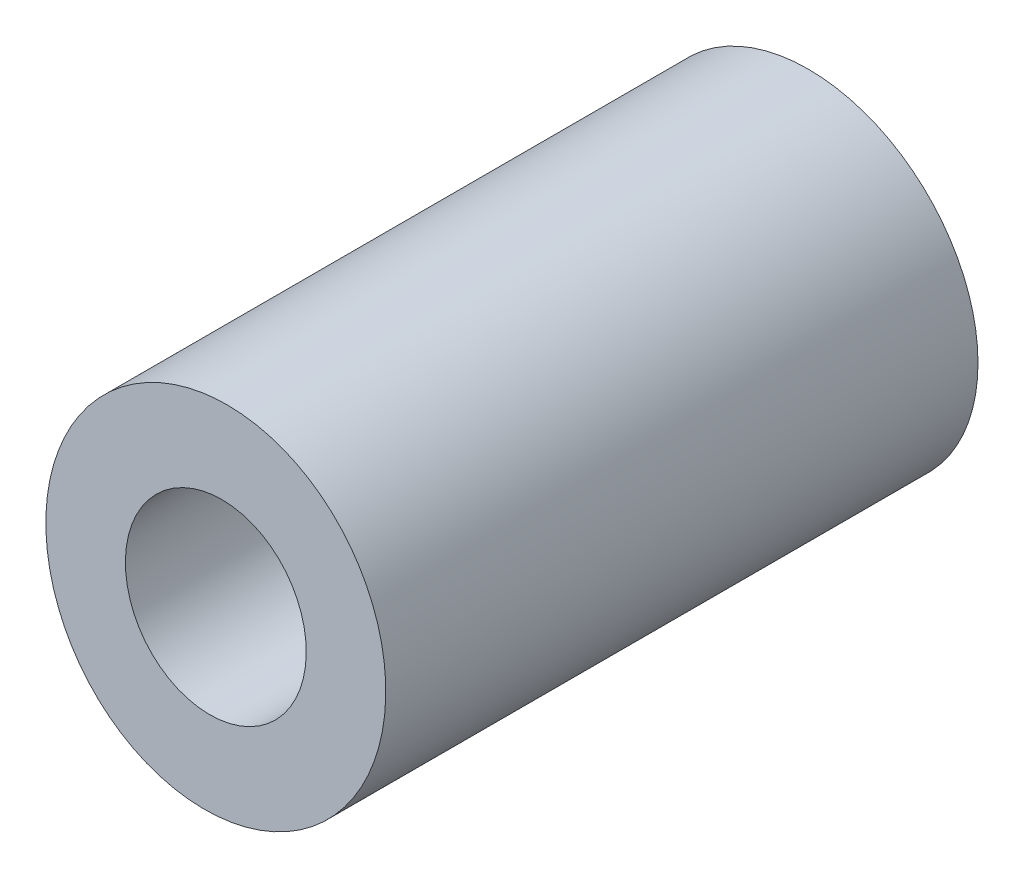
ISO-10303-21;
HEADER;
FILE_DESCRIPTION(('STEP AP214'),'2;1');
FILE_NAME('part.step','',(''),(''),'','','');
FILE_SCHEMA(('AUTOMOTIVE_DESIGN { 1 0 10303 214 1 1 1 1 }'));
ENDSEC;
DATA;
#1=APPLICATION_CONTEXT('core data for automotive mechanical design processes');
#2=APPLICATION_PROTOCOL_DEFINITION('international standard','automotive_design',2000,#1);
#3=PRODUCT_CONTEXT('',#1,'mechanical');
#4=PRODUCT('Part','Part','',(#3));
#5=PRODUCT_RELATED_PRODUCT_CATEGORY('part','',(#4));
#6=PRODUCT_DEFINITION_FORMATION('','',#4);
#7=PRODUCT_DEFINITION_CONTEXT('part definition',#1,'design');
#8=PRODUCT_DEFINITION('design','',#6,#7);
#9=PRODUCT_DEFINITION_SHAPE('','',#8);
#10=(LENGTH_UNIT() NAMED_UNIT(*) SI_UNIT(.MILLI.,.METRE.));
#11=(NAMED_UNIT(*) PLANE_ANGLE_UNIT() SI_UNIT($,.RADIAN.));
#12=(NAMED_UNIT(*) SI_UNIT($,.STERADIAN.) SOLID_ANGLE_UNIT());
#13=UNCERTAINTY_MEASURE_WITH_UNIT(LENGTH_MEASURE(1.E-05),#10,'distance_accuracy_value','');
#14=(GEOMETRIC_REPRESENTATION_CONTEXT(3) GLOBAL_UNCERTAINTY_ASSIGNED_CONTEXT((#13)) GLOBAL_UNIT_ASSIGNED_CONTEXT((#10,
#11,#12)) REPRESENTATION_CONTEXT('',''));
#15=CARTESIAN_POINT('',(0.,0.,0.));
#16=DIRECTION('',(0.,0.,1.));
#17=DIRECTION('',(1.,0.,0.));
#18=AXIS2_PLACEMENT_3D('',#15,#16,#17);
#19=CARTESIAN_POINT('',(-30.1436020560432,-132.433155104557,40.1678671930737));
#20=DIRECTION('',(0.,0.,-1.));
#21=DIRECTION('',(-1.,0.,0.));
#22=AXIS2_PLACEMENT_3D('',#19,#20,#21);
#23=CYLINDRICAL_SURFACE('',#22,6.35);
#24=CARTESIAN_POINT('',(-30.1436020560432,-132.433155104557,0.));
#25=DIRECTION('',(0.,0.,1.));
#26=DIRECTION('',(1.,0.,0.));
#27=AXIS2_PLACEMENT_3D('',#24,#25,#26);
#28=CIRCLE('',#27,6.35);
#29=CARTESIAN_POINT('',(-23.7936020560431,-132.433155104557,0.));
#30=VERTEX_POINT('',#29);
#31=EDGE_CURVE('E38',#30,#30,#28,.T.);
#32=ORIENTED_EDGE('',*,*,#31,.T.);
#33=EDGE_LOOP('',(#32));
#34=FACE_BOUND('',#33,.T.);
#35=CARTESIAN_POINT('',(-30.1436020560432,-132.433155104557,22.1875680710248));
#36=DIRECTION('',(0.,-0.0662739004000003,-0.99780146829205));
#37=DIRECTION('',(0.,0.99780146829205,-0.0662739004000003));
#38=AXIS2_PLACEMENT_3D('',#35,#36,#37);
#39=ELLIPSE('',#38,6.36399143696329,6.35);
#40=CARTESIAN_POINT('',(-30.1436020560432,-126.083155104557,21.7658015363851));
#41=VERTEX_POINT('',#40);
#42=EDGE_CURVE('E10',#41,#41,#39,.F.);
#43=ORIENTED_EDGE('',*,*,#42,.F.);
#44=EDGE_LOOP('',(#43));
#45=FACE_BOUND('',#44,.T.);
#46=ADVANCED_FACE('F31',(#34,#45),#23,.T.);
#47=CARTESIAN_POINT('',(-30.1436020560432,-132.433155104557,0.));
#48=DIRECTION('',(0.,0.,1.));
#49=DIRECTION('',(1.,0.,0.));
#50=AXIS2_PLACEMENT_3D('',#47,#48,#49);
#51=PLANE('',#50);
#52=ORIENTED_EDGE('',*,*,#31,.F.);
#53=EDGE_LOOP('',(#52));
#54=FACE_BOUND('',#53,.T.);
#55=CARTESIAN_POINT('',(-30.1436020560432,-132.433155104557,0.));
#56=DIRECTION('',(0.,0.,1.));
#57=DIRECTION('',(1.,0.,0.));
#58=AXIS2_PLACEMENT_3D('',#55,#56,#57);
#59=CIRCLE('',#58,3.3782);
#60=CARTESIAN_POINT('',(-26.7654020560431,-132.433155104557,0.));
#61=VERTEX_POINT('',#60);
#62=EDGE_CURVE('E43',#61,#61,#59,.T.);
#63=ORIENTED_EDGE('',*,*,#62,.T.);
#64=EDGE_LOOP('',(#63));
#65=FACE_BOUND('',#64,.T.);
#66=ADVANCED_FACE('F59',(#54,#65),#51,.F.);
#67=CARTESIAN_POINT('',(-30.1436020560432,-132.433155104557,40.1678671930737));
#68=DIRECTION('',(0.,0.,-1.));
#69=DIRECTION('',(-1.,0.,0.));
#70=AXIS2_PLACEMENT_3D('',#67,#68,#69);
#71=CYLINDRICAL_SURFACE('',#70,3.3782);
#72=ORIENTED_EDGE('',*,*,#62,.F.);
#73=EDGE_LOOP('',(#72));
#74=FACE_BOUND('',#73,.T.);
#75=CARTESIAN_POINT('',(-30.1436020560432,-132.433155104557,22.1875680710248));
#76=DIRECTION('',(0.,-0.0662739004000003,-0.99780146829205));
#77=DIRECTION('',(0.,0.99780146829205,-0.0662739004000003));
#78=AXIS2_PLACEMENT_3D('',#75,#76,#77);
#79=ELLIPSE('',#78,3.38564344446447,3.3782);
#80=CARTESIAN_POINT('',(-30.1436020560432,-129.054955104557,21.9631882745965));
#81=VERTEX_POINT('',#80);
#82=EDGE_CURVE('E34',#81,#81,#79,.F.);
#83=ORIENTED_EDGE('',*,*,#82,.T.);
#84=EDGE_LOOP('',(#83));
#85=FACE_BOUND('',#84,.T.);
#86=ADVANCED_FACE('F51',(#74,#85),#71,.F.);
#87=CARTESIAN_POINT('',(-105.643751672998,-117.000000000001,21.1624990400002));
#88=DIRECTION('',(0.,-0.0662739004000003,-0.99780146829205));
#89=DIRECTION('',(0.,0.99780146829205,-0.0662739004000003));
#90=AXIS2_PLACEMENT_3D('',#87,#88,#89);
#91=PLANE('',#90);
#92=ORIENTED_EDGE('',*,*,#82,.F.);
#93=EDGE_LOOP('',(#92));
#94=FACE_BOUND('',#93,.T.);
#95=ORIENTED_EDGE('',*,*,#42,.T.);
#96=EDGE_LOOP('',(#95));
#97=FACE_BOUND('',#96,.T.);
#98=ADVANCED_FACE('F53',(#94,#97),#91,.F.);
#99=CLOSED_SHELL('',(#46,#66,#86,#98));
#100=MANIFOLD_SOLID_BREP('B2',#99);
#101=ADVANCED_BREP_SHAPE_REPRESENTATION('',(#18,#100),#14);
#102=SHAPE_DEFINITION_REPRESENTATION(#9,#101);
ENDSEC;
END-ISO-10303-21;
